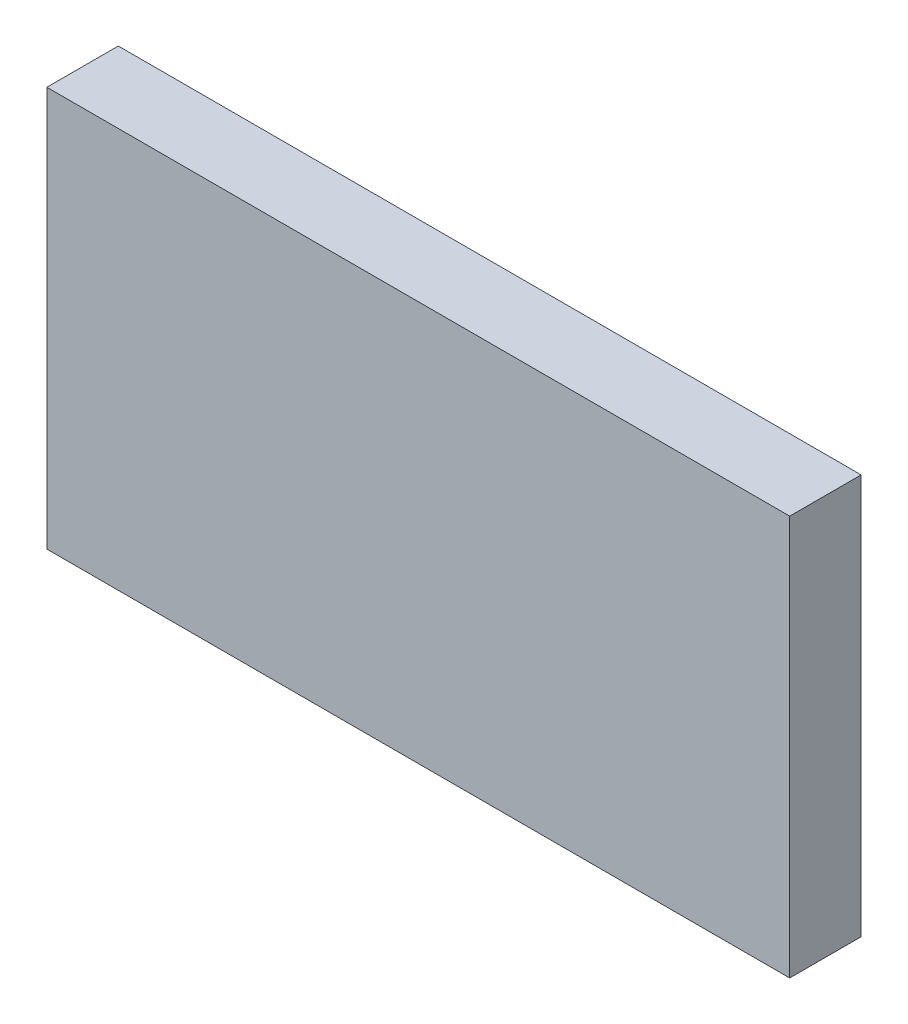
ISO-10303-21;
HEADER;
FILE_DESCRIPTION(('STEP AP214'),'2;1');
FILE_NAME('part.step','',(''),(''),'','','');
FILE_SCHEMA(('AUTOMOTIVE_DESIGN { 1 0 10303 214 1 1 1 1 }'));
ENDSEC;
DATA;
#1=APPLICATION_CONTEXT('core data for automotive mechanical design processes');
#2=APPLICATION_PROTOCOL_DEFINITION('international standard','automotive_design',2000,#1);
#3=PRODUCT_CONTEXT('',#1,'mechanical');
#4=PRODUCT('Part','Part','',(#3));
#5=PRODUCT_RELATED_PRODUCT_CATEGORY('part','',(#4));
#6=PRODUCT_DEFINITION_FORMATION('','',#4);
#7=PRODUCT_DEFINITION_CONTEXT('part definition',#1,'design');
#8=PRODUCT_DEFINITION('design','',#6,#7);
#9=PRODUCT_DEFINITION_SHAPE('','',#8);
#10=(LENGTH_UNIT() NAMED_UNIT(*) SI_UNIT(.MILLI.,.METRE.));
#11=(NAMED_UNIT(*) PLANE_ANGLE_UNIT() SI_UNIT($,.RADIAN.));
#12=(NAMED_UNIT(*) SI_UNIT($,.STERADIAN.) SOLID_ANGLE_UNIT());
#13=UNCERTAINTY_MEASURE_WITH_UNIT(LENGTH_MEASURE(1.E-05),#10,'distance_accuracy_value','');
#14=(GEOMETRIC_REPRESENTATION_CONTEXT(3) GLOBAL_UNCERTAINTY_ASSIGNED_CONTEXT((#13)) GLOBAL_UNIT_ASSIGNED_CONTEXT((#10,
#11,#12)) REPRESENTATION_CONTEXT('',''));
#15=CARTESIAN_POINT('',(0.,0.,0.));
#16=DIRECTION('',(0.,0.,1.));
#17=DIRECTION('',(1.,0.,0.));
#18=AXIS2_PLACEMENT_3D('',#15,#16,#17);
#19=CARTESIAN_POINT('',(0.,14.,0.));
#20=DIRECTION('',(1.,0.,0.));
#21=DIRECTION('',(0.,0.,-1.));
#22=AXIS2_PLACEMENT_3D('',#19,#20,#21);
#23=PLANE('',#22);
#24=DIRECTION('',(0.,0.,1.));
#25=VECTOR('',#24,1.);
#26=CARTESIAN_POINT('',(0.,0.,0.));
#27=LINE('',#26,#25);
#28=CARTESIAN_POINT('',(0.,0.,-2.5));
#29=VERTEX_POINT('',#28);
#30=CARTESIAN_POINT('',(0.,0.,0.));
#31=VERTEX_POINT('',#30);
#32=EDGE_CURVE('E96',#29,#31,#27,.T.);
#33=ORIENTED_EDGE('',*,*,#32,.T.);
#34=DIRECTION('',(0.,-1.,0.));
#35=VECTOR('',#34,1.);
#36=CARTESIAN_POINT('',(0.,14.,0.));
#37=LINE('',#36,#35);
#38=CARTESIAN_POINT('',(0.,14.,0.));
#39=VERTEX_POINT('',#38);
#40=EDGE_CURVE('E11',#39,#31,#37,.T.);
#41=ORIENTED_EDGE('',*,*,#40,.F.);
#42=DIRECTION('',(0.,0.,1.));
#43=VECTOR('',#42,1.);
#44=CARTESIAN_POINT('',(0.,14.,0.));
#45=LINE('',#44,#43);
#46=CARTESIAN_POINT('',(0.,14.,-2.5));
#47=VERTEX_POINT('',#46);
#48=EDGE_CURVE('E84',#47,#39,#45,.T.);
#49=ORIENTED_EDGE('',*,*,#48,.F.);
#50=DIRECTION('',(0.,-1.,0.));
#51=VECTOR('',#50,1.);
#52=CARTESIAN_POINT('',(0.,14.,-2.5));
#53=LINE('',#52,#51);
#54=EDGE_CURVE('E92',#47,#29,#53,.T.);
#55=ORIENTED_EDGE('',*,*,#54,.T.);
#56=EDGE_LOOP('',(#33,#41,#49,#55));
#57=FACE_BOUND('',#56,.T.);
#58=ADVANCED_FACE('F33',(#57),#23,.F.);
#59=CARTESIAN_POINT('',(0.,14.,0.));
#60=DIRECTION('',(0.,0.,-1.));
#61=DIRECTION('',(-1.,0.,0.));
#62=AXIS2_PLACEMENT_3D('',#59,#60,#61);
#63=PLANE('',#62);
#64=DIRECTION('',(1.,0.,0.));
#65=VECTOR('',#64,1.);
#66=CARTESIAN_POINT('',(0.,0.,0.));
#67=LINE('',#66,#65);
#68=CARTESIAN_POINT('',(26.,0.,0.));
#69=VERTEX_POINT('',#68);
#70=EDGE_CURVE('E88',#31,#69,#67,.T.);
#71=ORIENTED_EDGE('',*,*,#70,.T.);
#72=DIRECTION('',(0.,-1.,0.));
#73=VECTOR('',#72,1.);
#74=CARTESIAN_POINT('',(26.,14.,0.));
#75=LINE('',#74,#73);
#76=CARTESIAN_POINT('',(26.,14.,0.));
#77=VERTEX_POINT('',#76);
#78=EDGE_CURVE('E41',#77,#69,#75,.T.);
#79=ORIENTED_EDGE('',*,*,#78,.F.);
#80=DIRECTION('',(1.,0.,0.));
#81=VECTOR('',#80,1.);
#82=CARTESIAN_POINT('',(0.,14.,0.));
#83=LINE('',#82,#81);
#84=EDGE_CURVE('E79',#39,#77,#83,.T.);
#85=ORIENTED_EDGE('',*,*,#84,.F.);
#86=ORIENTED_EDGE('',*,*,#40,.T.);
#87=EDGE_LOOP('',(#71,#79,#85,#86));
#88=FACE_BOUND('',#87,.T.);
#89=ADVANCED_FACE('F87',(#88),#63,.F.);
#90=CARTESIAN_POINT('',(26.,14.,0.));
#91=DIRECTION('',(-1.,0.,0.));
#92=DIRECTION('',(0.,0.,1.));
#93=AXIS2_PLACEMENT_3D('',#90,#91,#92);
#94=PLANE('',#93);
#95=DIRECTION('',(0.,0.,-1.));
#96=VECTOR('',#95,1.);
#97=CARTESIAN_POINT('',(26.,0.,0.));
#98=LINE('',#97,#96);
#99=CARTESIAN_POINT('',(26.,0.,-2.5));
#100=VERTEX_POINT('',#99);
#101=EDGE_CURVE('E66',#69,#100,#98,.T.);
#102=ORIENTED_EDGE('',*,*,#101,.T.);
#103=DIRECTION('',(0.,-1.,0.));
#104=VECTOR('',#103,1.);
#105=CARTESIAN_POINT('',(26.,14.,-2.5));
#106=LINE('',#105,#104);
#107=CARTESIAN_POINT('',(26.,14.,-2.5));
#108=VERTEX_POINT('',#107);
#109=EDGE_CURVE('E89',#108,#100,#106,.T.);
#110=ORIENTED_EDGE('',*,*,#109,.F.);
#111=DIRECTION('',(0.,0.,-1.));
#112=VECTOR('',#111,1.);
#113=CARTESIAN_POINT('',(26.,14.,0.));
#114=LINE('',#113,#112);
#115=EDGE_CURVE('E82',#77,#108,#114,.T.);
#116=ORIENTED_EDGE('',*,*,#115,.F.);
#117=ORIENTED_EDGE('',*,*,#78,.T.);
#118=EDGE_LOOP('',(#102,#110,#116,#117));
#119=FACE_BOUND('',#118,.T.);
#120=ADVANCED_FACE('F90',(#119),#94,.F.);
#121=CARTESIAN_POINT('',(0.,14.,-2.5));
#122=DIRECTION('',(0.,0.,1.));
#123=DIRECTION('',(1.,0.,0.));
#124=AXIS2_PLACEMENT_3D('',#121,#122,#123);
#125=PLANE('',#124);
#126=DIRECTION('',(-1.,0.,0.));
#127=VECTOR('',#126,1.);
#128=CARTESIAN_POINT('',(0.,0.,-2.5));
#129=LINE('',#128,#127);
#130=EDGE_CURVE('E72',#100,#29,#129,.T.);
#131=ORIENTED_EDGE('',*,*,#130,.T.);
#132=ORIENTED_EDGE('',*,*,#54,.F.);
#133=DIRECTION('',(-1.,0.,0.));
#134=VECTOR('',#133,1.);
#135=CARTESIAN_POINT('',(0.,14.,-2.5));
#136=LINE('',#135,#134);
#137=EDGE_CURVE('E49',#108,#47,#136,.T.);
#138=ORIENTED_EDGE('',*,*,#137,.F.);
#139=ORIENTED_EDGE('',*,*,#109,.T.);
#140=EDGE_LOOP('',(#131,#132,#138,#139));
#141=FACE_BOUND('',#140,.T.);
#142=ADVANCED_FACE('F103',(#141),#125,.F.);
#143=CARTESIAN_POINT('',(0.,14.,0.));
#144=DIRECTION('',(0.,-1.,0.));
#145=DIRECTION('',(0.,0.,-1.));
#146=AXIS2_PLACEMENT_3D('',#143,#144,#145);
#147=PLANE('',#146);
#148=ORIENTED_EDGE('',*,*,#48,.T.);
#149=ORIENTED_EDGE('',*,*,#84,.T.);
#150=ORIENTED_EDGE('',*,*,#115,.T.);
#151=ORIENTED_EDGE('',*,*,#137,.T.);
#152=EDGE_LOOP('',(#148,#149,#150,#151));
#153=FACE_BOUND('',#152,.T.);
#154=ADVANCED_FACE('F80',(#153),#147,.F.);
#155=CARTESIAN_POINT('',(0.,0.,0.));
#156=DIRECTION('',(0.,-1.,0.));
#157=DIRECTION('',(0.,0.,-1.));
#158=AXIS2_PLACEMENT_3D('',#155,#156,#157);
#159=PLANE('',#158);
#160=ORIENTED_EDGE('',*,*,#32,.F.);
#161=ORIENTED_EDGE('',*,*,#130,.F.);
#162=ORIENTED_EDGE('',*,*,#101,.F.);
#163=ORIENTED_EDGE('',*,*,#70,.F.);
#164=EDGE_LOOP('',(#160,#161,#162,#163));
#165=FACE_BOUND('',#164,.T.);
#166=ADVANCED_FACE('F106',(#165),#159,.T.);
#167=CLOSED_SHELL('',(#58,#89,#120,#142,#154,#166));
#168=MANIFOLD_SOLID_BREP('B2',#167);
#169=ADVANCED_BREP_SHAPE_REPRESENTATION('',(#18,#168),#14);
#170=SHAPE_DEFINITION_REPRESENTATION(#9,#169);
ENDSEC;
END-ISO-10303-21;
